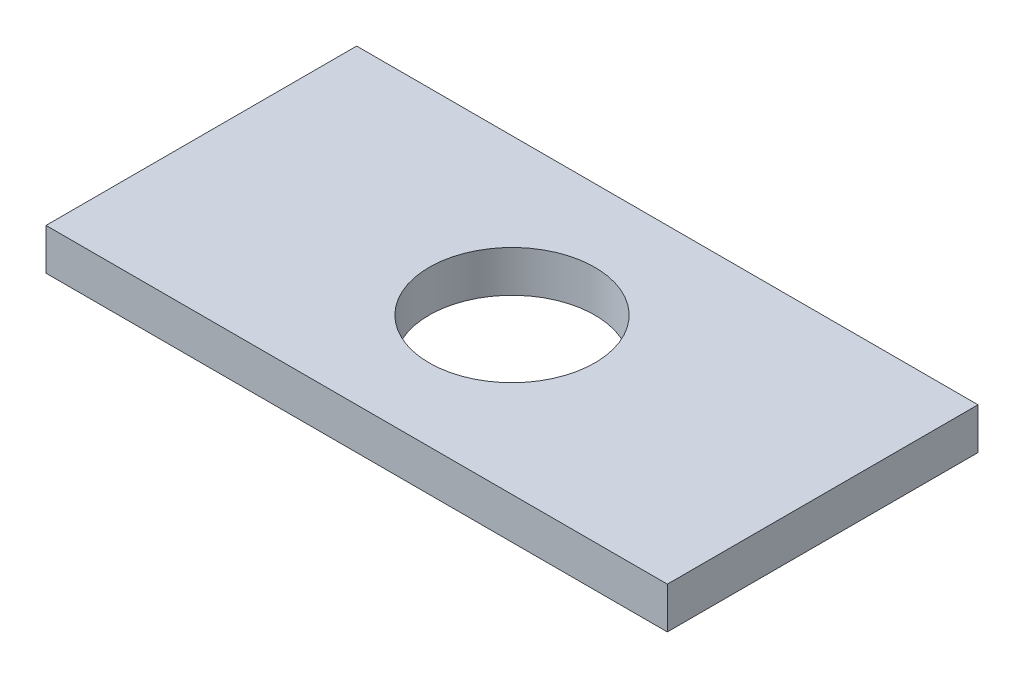
ISO-10303-21;
HEADER;
FILE_DESCRIPTION(('STEP AP214'),'2;1');
FILE_NAME('part.step','',(''),(''),'','','');
FILE_SCHEMA(('AUTOMOTIVE_DESIGN { 1 0 10303 214 1 1 1 1 }'));
ENDSEC;
DATA;
#1=APPLICATION_CONTEXT('core data for automotive mechanical design processes');
#2=APPLICATION_PROTOCOL_DEFINITION('international standard','automotive_design',2000,#1);
#3=PRODUCT_CONTEXT('',#1,'mechanical');
#4=PRODUCT('Part','Part','',(#3));
#5=PRODUCT_RELATED_PRODUCT_CATEGORY('part','',(#4));
#6=PRODUCT_DEFINITION_FORMATION('','',#4);
#7=PRODUCT_DEFINITION_CONTEXT('part definition',#1,'design');
#8=PRODUCT_DEFINITION('design','',#6,#7);
#9=PRODUCT_DEFINITION_SHAPE('','',#8);
#10=(LENGTH_UNIT() NAMED_UNIT(*) SI_UNIT(.MILLI.,.METRE.));
#11=(NAMED_UNIT(*) PLANE_ANGLE_UNIT() SI_UNIT($,.RADIAN.));
#12=(NAMED_UNIT(*) SI_UNIT($,.STERADIAN.) SOLID_ANGLE_UNIT());
#13=UNCERTAINTY_MEASURE_WITH_UNIT(LENGTH_MEASURE(1.E-05),#10,'distance_accuracy_value','');
#14=(GEOMETRIC_REPRESENTATION_CONTEXT(3) GLOBAL_UNCERTAINTY_ASSIGNED_CONTEXT((#13)) GLOBAL_UNIT_ASSIGNED_CONTEXT((#10,
#11,#12)) REPRESENTATION_CONTEXT('',''));
#15=CARTESIAN_POINT('',(0.,0.,0.));
#16=DIRECTION('',(0.,0.,1.));
#17=DIRECTION('',(1.,0.,0.));
#18=AXIS2_PLACEMENT_3D('',#15,#16,#17);
#19=CARTESIAN_POINT('',(0.,2.,0.));
#20=DIRECTION('',(0.,-1.,0.));
#21=DIRECTION('',(0.,0.,-1.));
#22=AXIS2_PLACEMENT_3D('',#19,#20,#21);
#23=PLANE('',#22);
#24=DIRECTION('',(0.,0.,-1.));
#25=VECTOR('',#24,1.);
#26=CARTESIAN_POINT('',(0.,2.,0.));
#27=LINE('',#26,#25);
#28=CARTESIAN_POINT('',(0.,2.,0.));
#29=VERTEX_POINT('',#28);
#30=CARTESIAN_POINT('',(0.,2.,-15.));
#31=VERTEX_POINT('',#30);
#32=EDGE_CURVE('E109',#29,#31,#27,.T.);
#33=ORIENTED_EDGE('',*,*,#32,.F.);
#34=DIRECTION('',(1.,0.,0.));
#35=VECTOR('',#34,1.);
#36=CARTESIAN_POINT('',(0.,2.,0.));
#37=LINE('',#36,#35);
#38=CARTESIAN_POINT('',(30.,2.,0.));
#39=VERTEX_POINT('',#38);
#40=EDGE_CURVE('E99',#29,#39,#37,.T.);
#41=ORIENTED_EDGE('',*,*,#40,.T.);
#42=DIRECTION('',(0.,0.,-1.));
#43=VECTOR('',#42,1.);
#44=CARTESIAN_POINT('',(30.,2.,0.));
#45=LINE('',#44,#43);
#46=CARTESIAN_POINT('',(30.,2.,-15.));
#47=VERTEX_POINT('',#46);
#48=EDGE_CURVE('E94',#39,#47,#45,.T.);
#49=ORIENTED_EDGE('',*,*,#48,.T.);
#50=DIRECTION('',(1.,0.,0.));
#51=VECTOR('',#50,1.);
#52=CARTESIAN_POINT('',(0.,2.,-15.));
#53=LINE('',#52,#51);
#54=EDGE_CURVE('E98',#31,#47,#53,.T.);
#55=ORIENTED_EDGE('',*,*,#54,.F.);
#56=EDGE_LOOP('',(#33,#41,#49,#55));
#57=FACE_BOUND('',#56,.T.);
#58=CARTESIAN_POINT('',(15.,2.,-7.5));
#59=DIRECTION('',(0.,1.,0.));
#60=DIRECTION('',(0.,0.,1.));
#61=AXIS2_PLACEMENT_3D('',#58,#59,#60);
#62=CIRCLE('',#61,4.);
#63=CARTESIAN_POINT('',(15.,2.,-3.5));
#64=VERTEX_POINT('',#63);
#65=EDGE_CURVE('E119',#64,#64,#62,.T.);
#66=ORIENTED_EDGE('',*,*,#65,.F.);
#67=EDGE_LOOP('',(#66));
#68=FACE_BOUND('',#67,.T.);
#69=ADVANCED_FACE('F48',(#57,#68),#23,.F.);
#70=CARTESIAN_POINT('',(0.,0.,0.));
#71=DIRECTION('',(0.,-1.,0.));
#72=DIRECTION('',(0.,0.,-1.));
#73=AXIS2_PLACEMENT_3D('',#70,#71,#72);
#74=PLANE('',#73);
#75=DIRECTION('',(0.,0.,-1.));
#76=VECTOR('',#75,1.);
#77=CARTESIAN_POINT('',(0.,0.,0.));
#78=LINE('',#77,#76);
#79=CARTESIAN_POINT('',(0.,0.,0.));
#80=VERTEX_POINT('',#79);
#81=CARTESIAN_POINT('',(0.,0.,-15.));
#82=VERTEX_POINT('',#81);
#83=EDGE_CURVE('E115',#80,#82,#78,.T.);
#84=ORIENTED_EDGE('',*,*,#83,.T.);
#85=DIRECTION('',(1.,0.,0.));
#86=VECTOR('',#85,1.);
#87=CARTESIAN_POINT('',(0.,0.,-15.));
#88=LINE('',#87,#86);
#89=CARTESIAN_POINT('',(30.,0.,-15.));
#90=VERTEX_POINT('',#89);
#91=EDGE_CURVE('E118',#82,#90,#88,.T.);
#92=ORIENTED_EDGE('',*,*,#91,.T.);
#93=DIRECTION('',(0.,0.,-1.));
#94=VECTOR('',#93,1.);
#95=CARTESIAN_POINT('',(30.,0.,0.));
#96=LINE('',#95,#94);
#97=CARTESIAN_POINT('',(30.,0.,0.));
#98=VERTEX_POINT('',#97);
#99=EDGE_CURVE('E106',#98,#90,#96,.T.);
#100=ORIENTED_EDGE('',*,*,#99,.F.);
#101=DIRECTION('',(1.,0.,0.));
#102=VECTOR('',#101,1.);
#103=CARTESIAN_POINT('',(0.,0.,0.));
#104=LINE('',#103,#102);
#105=EDGE_CURVE('E82',#80,#98,#104,.T.);
#106=ORIENTED_EDGE('',*,*,#105,.F.);
#107=EDGE_LOOP('',(#84,#92,#100,#106));
#108=FACE_BOUND('',#107,.T.);
#109=CARTESIAN_POINT('',(15.,0.,-7.5));
#110=DIRECTION('',(0.,1.,0.));
#111=DIRECTION('',(0.,0.,1.));
#112=AXIS2_PLACEMENT_3D('',#109,#110,#111);
#113=CIRCLE('',#112,4.);
#114=CARTESIAN_POINT('',(15.,0.,-3.5));
#115=VERTEX_POINT('',#114);
#116=EDGE_CURVE('E154',#115,#115,#113,.T.);
#117=ORIENTED_EDGE('',*,*,#116,.T.);
#118=EDGE_LOOP('',(#117));
#119=FACE_BOUND('',#118,.T.);
#120=ADVANCED_FACE('F124',(#108,#119),#74,.T.);
#121=CARTESIAN_POINT('',(0.,2.,0.));
#122=DIRECTION('',(-1.,0.,0.));
#123=DIRECTION('',(0.,0.,1.));
#124=AXIS2_PLACEMENT_3D('',#121,#122,#123);
#125=PLANE('',#124);
#126=ORIENTED_EDGE('',*,*,#83,.F.);
#127=DIRECTION('',(0.,-1.,0.));
#128=VECTOR('',#127,1.);
#129=CARTESIAN_POINT('',(0.,2.,0.));
#130=LINE('',#129,#128);
#131=EDGE_CURVE('E12',#29,#80,#130,.T.);
#132=ORIENTED_EDGE('',*,*,#131,.F.);
#133=ORIENTED_EDGE('',*,*,#32,.T.);
#134=DIRECTION('',(0.,-1.,0.));
#135=VECTOR('',#134,1.);
#136=CARTESIAN_POINT('',(0.,2.,-15.));
#137=LINE('',#136,#135);
#138=EDGE_CURVE('E52',#31,#82,#137,.T.);
#139=ORIENTED_EDGE('',*,*,#138,.T.);
#140=EDGE_LOOP('',(#126,#132,#133,#139));
#141=FACE_BOUND('',#140,.T.);
#142=ADVANCED_FACE('F50',(#141),#125,.T.);
#143=CARTESIAN_POINT('',(0.,2.,0.));
#144=DIRECTION('',(0.,0.,-1.));
#145=DIRECTION('',(-1.,0.,0.));
#146=AXIS2_PLACEMENT_3D('',#143,#144,#145);
#147=PLANE('',#146);
#148=ORIENTED_EDGE('',*,*,#105,.T.);
#149=DIRECTION('',(0.,-1.,0.));
#150=VECTOR('',#149,1.);
#151=CARTESIAN_POINT('',(30.,2.,0.));
#152=LINE('',#151,#150);
#153=EDGE_CURVE('E58',#39,#98,#152,.T.);
#154=ORIENTED_EDGE('',*,*,#153,.F.);
#155=ORIENTED_EDGE('',*,*,#40,.F.);
#156=ORIENTED_EDGE('',*,*,#131,.T.);
#157=EDGE_LOOP('',(#148,#154,#155,#156));
#158=FACE_BOUND('',#157,.T.);
#159=ADVANCED_FACE('F127',(#158),#147,.F.);
#160=CARTESIAN_POINT('',(30.,2.,0.));
#161=DIRECTION('',(-1.,0.,0.));
#162=DIRECTION('',(0.,0.,1.));
#163=AXIS2_PLACEMENT_3D('',#160,#161,#162);
#164=PLANE('',#163);
#165=ORIENTED_EDGE('',*,*,#99,.T.);
#166=DIRECTION('',(0.,-1.,0.));
#167=VECTOR('',#166,1.);
#168=CARTESIAN_POINT('',(30.,2.,-15.));
#169=LINE('',#168,#167);
#170=EDGE_CURVE('E103',#47,#90,#169,.T.);
#171=ORIENTED_EDGE('',*,*,#170,.F.);
#172=ORIENTED_EDGE('',*,*,#48,.F.);
#173=ORIENTED_EDGE('',*,*,#153,.T.);
#174=EDGE_LOOP('',(#165,#171,#172,#173));
#175=FACE_BOUND('',#174,.T.);
#176=ADVANCED_FACE('F104',(#175),#164,.F.);
#177=CARTESIAN_POINT('',(0.,2.,-15.));
#178=DIRECTION('',(0.,0.,-1.));
#179=DIRECTION('',(-1.,0.,0.));
#180=AXIS2_PLACEMENT_3D('',#177,#178,#179);
#181=PLANE('',#180);
#182=ORIENTED_EDGE('',*,*,#91,.F.);
#183=ORIENTED_EDGE('',*,*,#138,.F.);
#184=ORIENTED_EDGE('',*,*,#54,.T.);
#185=ORIENTED_EDGE('',*,*,#170,.T.);
#186=EDGE_LOOP('',(#182,#183,#184,#185));
#187=FACE_BOUND('',#186,.T.);
#188=ADVANCED_FACE('F108',(#187),#181,.T.);
#189=CARTESIAN_POINT('',(15.,2.,-7.5));
#190=DIRECTION('',(0.,-1.,0.));
#191=DIRECTION('',(0.,0.,-1.));
#192=AXIS2_PLACEMENT_3D('',#189,#190,#191);
#193=CYLINDRICAL_SURFACE('',#192,4.);
#194=ORIENTED_EDGE('',*,*,#65,.T.);
#195=EDGE_LOOP('',(#194));
#196=FACE_BOUND('',#195,.T.);
#197=ORIENTED_EDGE('',*,*,#116,.F.);
#198=EDGE_LOOP('',(#197));
#199=FACE_BOUND('',#198,.T.);
#200=ADVANCED_FACE('F139',(#196,#199),#193,.F.);
#201=CLOSED_SHELL('',(#69,#120,#142,#159,#176,#188,#200));
#202=MANIFOLD_SOLID_BREP('B2',#201);
#203=ADVANCED_BREP_SHAPE_REPRESENTATION('',(#18,#202),#14);
#204=SHAPE_DEFINITION_REPRESENTATION(#9,#203);
ENDSEC;
END-ISO-10303-21;
